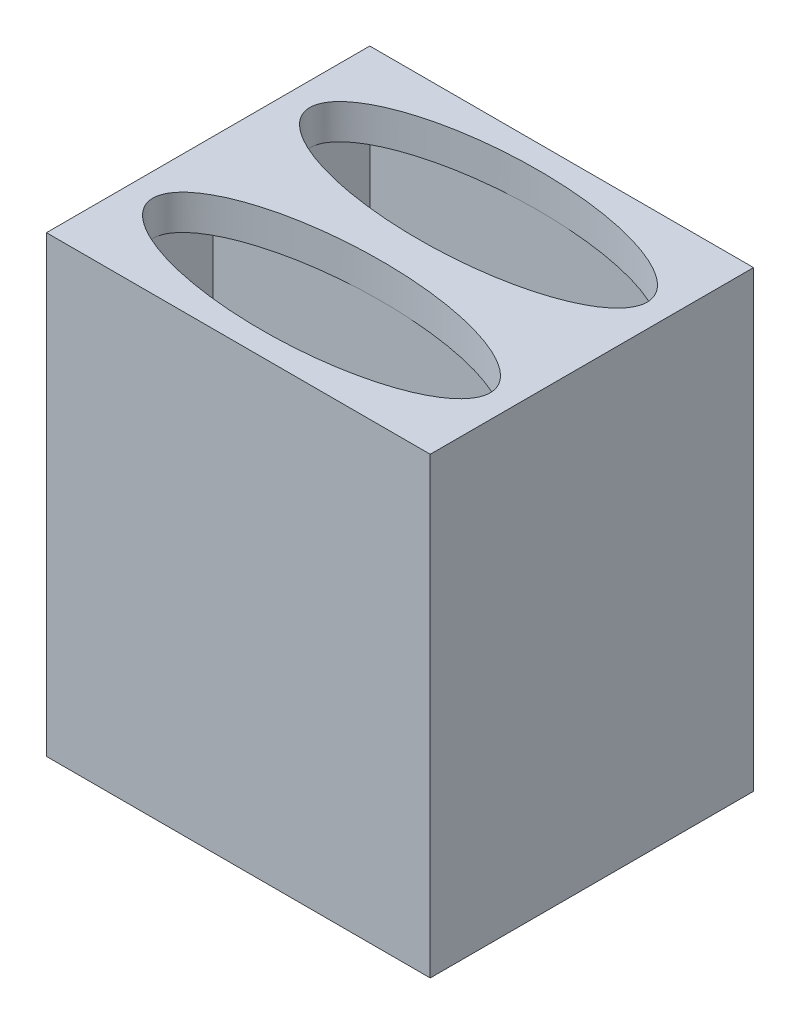
ISO-10303-21;
HEADER;
FILE_DESCRIPTION(('STEP AP214'),'2;1');
FILE_NAME('part.step','',(''),(''),'','','');
FILE_SCHEMA(('AUTOMOTIVE_DESIGN { 1 0 10303 214 1 1 1 1 }'));
ENDSEC;
DATA;
#1=APPLICATION_CONTEXT('core data for automotive mechanical design processes');
#2=APPLICATION_PROTOCOL_DEFINITION('international standard','automotive_design',2000,#1);
#3=PRODUCT_CONTEXT('',#1,'mechanical');
#4=PRODUCT('Part','Part','',(#3));
#5=PRODUCT_RELATED_PRODUCT_CATEGORY('part','',(#4));
#6=PRODUCT_DEFINITION_FORMATION('','',#4);
#7=PRODUCT_DEFINITION_CONTEXT('part definition',#1,'design');
#8=PRODUCT_DEFINITION('design','',#6,#7);
#9=PRODUCT_DEFINITION_SHAPE('','',#8);
#10=(LENGTH_UNIT() NAMED_UNIT(*) SI_UNIT(.MILLI.,.METRE.));
#11=(NAMED_UNIT(*) PLANE_ANGLE_UNIT() SI_UNIT($,.RADIAN.));
#12=(NAMED_UNIT(*) SI_UNIT($,.STERADIAN.) SOLID_ANGLE_UNIT());
#13=UNCERTAINTY_MEASURE_WITH_UNIT(LENGTH_MEASURE(1.E-05),#10,'distance_accuracy_value','');
#14=(GEOMETRIC_REPRESENTATION_CONTEXT(3) GLOBAL_UNCERTAINTY_ASSIGNED_CONTEXT((#13)) GLOBAL_UNIT_ASSIGNED_CONTEXT((#10,
#11,#12)) REPRESENTATION_CONTEXT('',''));
#15=CARTESIAN_POINT('',(0.,0.,0.));
#16=DIRECTION('',(0.,0.,1.));
#17=DIRECTION('',(1.,0.,0.));
#18=AXIS2_PLACEMENT_3D('',#15,#16,#17);
#19=CARTESIAN_POINT('',(0.,0.,0.));
#20=DIRECTION('',(0.,1.,0.));
#21=DIRECTION('',(0.,0.,1.));
#22=AXIS2_PLACEMENT_3D('',#19,#20,#21);
#23=PLANE('',#22);
#24=DIRECTION('',(1.,0.,0.));
#25=VECTOR('',#24,1.);
#26=CARTESIAN_POINT('',(-16.5,0.,20.65));
#27=LINE('',#26,#25);
#28=CARTESIAN_POINT('',(-16.5,0.,20.65));
#29=VERTEX_POINT('',#28);
#30=CARTESIAN_POINT('',(16.5,0.,20.65));
#31=VERTEX_POINT('',#30);
#32=EDGE_CURVE('E169',#29,#31,#27,.T.);
#33=ORIENTED_EDGE('',*,*,#32,.F.);
#34=DIRECTION('',(0.,0.,1.));
#35=VECTOR('',#34,1.);
#36=CARTESIAN_POINT('',(-16.5,0.,7.15));
#37=LINE('',#36,#35);
#38=CARTESIAN_POINT('',(-16.5,0.,-7.15));
#39=VERTEX_POINT('',#38);
#40=EDGE_CURVE('E164',#39,#29,#37,.T.);
#41=ORIENTED_EDGE('',*,*,#40,.F.);
#42=DIRECTION('',(-1.,0.,0.));
#43=VECTOR('',#42,1.);
#44=CARTESIAN_POINT('',(-16.5,0.,-7.15));
#45=LINE('',#44,#43);
#46=CARTESIAN_POINT('',(16.5,0.,-7.15));
#47=VERTEX_POINT('',#46);
#48=EDGE_CURVE('E275',#47,#39,#45,.T.);
#49=ORIENTED_EDGE('',*,*,#48,.F.);
#50=DIRECTION('',(0.,0.,-1.));
#51=VECTOR('',#50,1.);
#52=CARTESIAN_POINT('',(16.5,0.,7.15));
#53=LINE('',#52,#51);
#54=EDGE_CURVE('E277',#31,#47,#53,.T.);
#55=ORIENTED_EDGE('',*,*,#54,.F.);
#56=EDGE_LOOP('',(#33,#41,#49,#55));
#57=FACE_BOUND('',#56,.T.);
#58=DIRECTION('',(0.,0.,-1.));
#59=VECTOR('',#58,1.);
#60=CARTESIAN_POINT('',(14.5,0.,18.65));
#61=LINE('',#60,#59);
#62=CARTESIAN_POINT('',(14.5,0.,18.65));
#63=VERTEX_POINT('',#62);
#64=CARTESIAN_POINT('',(14.5,0.,8.35));
#65=VERTEX_POINT('',#64);
#66=EDGE_CURVE('E187',#63,#65,#61,.T.);
#67=ORIENTED_EDGE('',*,*,#66,.T.);
#68=DIRECTION('',(-1.,0.,0.));
#69=VECTOR('',#68,1.);
#70=CARTESIAN_POINT('',(-14.5,0.,8.35));
#71=LINE('',#70,#69);
#72=CARTESIAN_POINT('',(-14.5,0.,8.35));
#73=VERTEX_POINT('',#72);
#74=EDGE_CURVE('E205',#65,#73,#71,.T.);
#75=ORIENTED_EDGE('',*,*,#74,.T.);
#76=DIRECTION('',(0.,0.,1.));
#77=VECTOR('',#76,1.);
#78=CARTESIAN_POINT('',(-14.5,0.,18.65));
#79=LINE('',#78,#77);
#80=CARTESIAN_POINT('',(-14.5,0.,18.65));
#81=VERTEX_POINT('',#80);
#82=EDGE_CURVE('E208',#73,#81,#79,.T.);
#83=ORIENTED_EDGE('',*,*,#82,.T.);
#84=DIRECTION('',(1.,0.,0.));
#85=VECTOR('',#84,1.);
#86=CARTESIAN_POINT('',(-14.5,0.,18.65));
#87=LINE('',#86,#85);
#88=EDGE_CURVE('E192',#81,#63,#87,.T.);
#89=ORIENTED_EDGE('',*,*,#88,.T.);
#90=EDGE_LOOP('',(#67,#75,#83,#89));
#91=FACE_BOUND('',#90,.T.);
#92=DIRECTION('',(0.,0.,-1.));
#93=VECTOR('',#92,1.);
#94=CARTESIAN_POINT('',(14.5,0.,5.15));
#95=LINE('',#94,#93);
#96=CARTESIAN_POINT('',(14.5,0.,5.15));
#97=VERTEX_POINT('',#96);
#98=CARTESIAN_POINT('',(14.5,0.,-5.15));
#99=VERTEX_POINT('',#98);
#100=EDGE_CURVE('E158',#97,#99,#95,.T.);
#101=ORIENTED_EDGE('',*,*,#100,.T.);
#102=DIRECTION('',(-1.,0.,0.));
#103=VECTOR('',#102,1.);
#104=CARTESIAN_POINT('',(-14.5,0.,-5.15));
#105=LINE('',#104,#103);
#106=CARTESIAN_POINT('',(-14.5,0.,-5.15));
#107=VERTEX_POINT('',#106);
#108=EDGE_CURVE('E300',#99,#107,#105,.T.);
#109=ORIENTED_EDGE('',*,*,#108,.T.);
#110=DIRECTION('',(0.,0.,1.));
#111=VECTOR('',#110,1.);
#112=CARTESIAN_POINT('',(-14.5,0.,5.15));
#113=LINE('',#112,#111);
#114=CARTESIAN_POINT('',(-14.5,0.,5.15));
#115=VERTEX_POINT('',#114);
#116=EDGE_CURVE('E297',#107,#115,#113,.T.);
#117=ORIENTED_EDGE('',*,*,#116,.T.);
#118=DIRECTION('',(1.,0.,0.));
#119=VECTOR('',#118,1.);
#120=CARTESIAN_POINT('',(-14.5,0.,5.15));
#121=LINE('',#120,#119);
#122=EDGE_CURVE('E293',#115,#97,#121,.T.);
#123=ORIENTED_EDGE('',*,*,#122,.T.);
#124=EDGE_LOOP('',(#101,#109,#117,#123));
#125=FACE_BOUND('',#124,.T.);
#126=ADVANCED_FACE('F33',(#57,#91,#125),#23,.F.);
#127=CARTESIAN_POINT('',(16.5,36.,7.15));
#128=DIRECTION('',(-1.,0.,0.));
#129=DIRECTION('',(0.,0.,1.));
#130=AXIS2_PLACEMENT_3D('',#127,#128,#129);
#131=PLANE('',#130);
#132=DIRECTION('',(0.,0.,-1.));
#133=VECTOR('',#132,1.);
#134=CARTESIAN_POINT('',(16.5,39.,-7.15));
#135=LINE('',#134,#133);
#136=CARTESIAN_POINT('',(16.5,39.,20.65));
#137=VERTEX_POINT('',#136);
#138=CARTESIAN_POINT('',(16.5,39.,-7.15));
#139=VERTEX_POINT('',#138);
#140=EDGE_CURVE('E229',#137,#139,#135,.T.);
#141=ORIENTED_EDGE('',*,*,#140,.F.);
#142=DIRECTION('',(0.,-1.,0.));
#143=VECTOR('',#142,1.);
#144=CARTESIAN_POINT('',(16.5,36.,20.65));
#145=LINE('',#144,#143);
#146=EDGE_CURVE('E168',#137,#31,#145,.T.);
#147=ORIENTED_EDGE('',*,*,#146,.T.);
#148=ORIENTED_EDGE('',*,*,#54,.T.);
#149=DIRECTION('',(0.,-1.,0.));
#150=VECTOR('',#149,1.);
#151=CARTESIAN_POINT('',(16.5,36.,-7.15));
#152=LINE('',#151,#150);
#153=EDGE_CURVE('E11',#139,#47,#152,.T.);
#154=ORIENTED_EDGE('',*,*,#153,.F.);
#155=EDGE_LOOP('',(#141,#147,#148,#154));
#156=FACE_BOUND('',#155,.T.);
#157=ADVANCED_FACE('F35',(#156),#131,.F.);
#158=CARTESIAN_POINT('',(-16.5,36.,-7.15));
#159=DIRECTION('',(0.,0.,1.));
#160=DIRECTION('',(1.,0.,0.));
#161=AXIS2_PLACEMENT_3D('',#158,#159,#160);
#162=PLANE('',#161);
#163=ORIENTED_EDGE('',*,*,#48,.T.);
#164=DIRECTION('',(0.,-1.,0.));
#165=VECTOR('',#164,1.);
#166=CARTESIAN_POINT('',(-16.5,36.,-7.15));
#167=LINE('',#166,#165);
#168=CARTESIAN_POINT('',(-16.5,39.,-7.15));
#169=VERTEX_POINT('',#168);
#170=EDGE_CURVE('E41',#169,#39,#167,.T.);
#171=ORIENTED_EDGE('',*,*,#170,.F.);
#172=DIRECTION('',(-1.,0.,0.));
#173=VECTOR('',#172,1.);
#174=CARTESIAN_POINT('',(16.5,39.,-7.15));
#175=LINE('',#174,#173);
#176=EDGE_CURVE('E155',#139,#169,#175,.T.);
#177=ORIENTED_EDGE('',*,*,#176,.F.);
#178=ORIENTED_EDGE('',*,*,#153,.T.);
#179=EDGE_LOOP('',(#163,#171,#177,#178));
#180=FACE_BOUND('',#179,.T.);
#181=ADVANCED_FACE('F267',(#180),#162,.F.);
#182=CARTESIAN_POINT('',(-16.5,36.,7.15));
#183=DIRECTION('',(1.,0.,0.));
#184=DIRECTION('',(0.,0.,-1.));
#185=AXIS2_PLACEMENT_3D('',#182,#183,#184);
#186=PLANE('',#185);
#187=DIRECTION('',(0.,-1.,0.));
#188=VECTOR('',#187,1.);
#189=CARTESIAN_POINT('',(-16.5,36.,20.65));
#190=LINE('',#189,#188);
#191=CARTESIAN_POINT('',(-16.5,39.,20.65));
#192=VERTEX_POINT('',#191);
#193=EDGE_CURVE('E161',#192,#29,#190,.T.);
#194=ORIENTED_EDGE('',*,*,#193,.F.);
#195=DIRECTION('',(0.,0.,1.));
#196=VECTOR('',#195,1.);
#197=CARTESIAN_POINT('',(-16.5,39.,-7.15));
#198=LINE('',#197,#196);
#199=EDGE_CURVE('E148',#169,#192,#198,.T.);
#200=ORIENTED_EDGE('',*,*,#199,.F.);
#201=ORIENTED_EDGE('',*,*,#170,.T.);
#202=ORIENTED_EDGE('',*,*,#40,.T.);
#203=EDGE_LOOP('',(#194,#200,#201,#202));
#204=FACE_BOUND('',#203,.T.);
#205=ADVANCED_FACE('F162',(#204),#186,.F.);
#206=CARTESIAN_POINT('',(14.5,36.,5.15));
#207=DIRECTION('',(-1.,0.,0.));
#208=DIRECTION('',(0.,0.,1.));
#209=AXIS2_PLACEMENT_3D('',#206,#207,#208);
#210=PLANE('',#209);
#211=ORIENTED_EDGE('',*,*,#100,.F.);
#212=DIRECTION('',(0.,-1.,0.));
#213=VECTOR('',#212,1.);
#214=CARTESIAN_POINT('',(14.5,36.,5.15));
#215=LINE('',#214,#213);
#216=CARTESIAN_POINT('',(14.5,36.,5.15));
#217=VERTEX_POINT('',#216);
#218=EDGE_CURVE('E290',#217,#97,#215,.T.);
#219=ORIENTED_EDGE('',*,*,#218,.F.);
#220=DIRECTION('',(0.,0.,-1.));
#221=VECTOR('',#220,1.);
#222=CARTESIAN_POINT('',(14.5,36.,5.15));
#223=LINE('',#222,#221);
#224=CARTESIAN_POINT('',(14.5,36.,0.));
#225=VERTEX_POINT('',#224);
#226=EDGE_CURVE('E315',#217,#225,#223,.T.);
#227=ORIENTED_EDGE('',*,*,#226,.T.);
#228=CARTESIAN_POINT('',(14.5,36.,-5.15));
#229=VERTEX_POINT('',#228);
#230=EDGE_CURVE('E296',#225,#229,#223,.T.);
#231=ORIENTED_EDGE('',*,*,#230,.T.);
#232=DIRECTION('',(0.,-1.,0.));
#233=VECTOR('',#232,1.);
#234=CARTESIAN_POINT('',(14.5,36.,-5.15));
#235=LINE('',#234,#233);
#236=EDGE_CURVE('E283',#229,#99,#235,.T.);
#237=ORIENTED_EDGE('',*,*,#236,.T.);
#238=EDGE_LOOP('',(#211,#219,#227,#231,#237));
#239=FACE_BOUND('',#238,.T.);
#240=ADVANCED_FACE('F258',(#239),#210,.T.);
#241=CARTESIAN_POINT('',(-14.5,36.,-5.15));
#242=DIRECTION('',(0.,0.,1.));
#243=DIRECTION('',(1.,0.,0.));
#244=AXIS2_PLACEMENT_3D('',#241,#242,#243);
#245=PLANE('',#244);
#246=ORIENTED_EDGE('',*,*,#108,.F.);
#247=ORIENTED_EDGE('',*,*,#236,.F.);
#248=DIRECTION('',(-1.,0.,0.));
#249=VECTOR('',#248,1.);
#250=CARTESIAN_POINT('',(-14.5,36.,-5.15));
#251=LINE('',#250,#249);
#252=CARTESIAN_POINT('',(0.,36.,-5.15));
#253=VERTEX_POINT('',#252);
#254=EDGE_CURVE('E311',#229,#253,#251,.T.);
#255=ORIENTED_EDGE('',*,*,#254,.T.);
#256=CARTESIAN_POINT('',(-14.5,36.,-5.15));
#257=VERTEX_POINT('',#256);
#258=EDGE_CURVE('E314',#253,#257,#251,.T.);
#259=ORIENTED_EDGE('',*,*,#258,.T.);
#260=DIRECTION('',(0.,-1.,0.));
#261=VECTOR('',#260,1.);
#262=CARTESIAN_POINT('',(-14.5,36.,-5.15));
#263=LINE('',#262,#261);
#264=EDGE_CURVE('E286',#257,#107,#263,.T.);
#265=ORIENTED_EDGE('',*,*,#264,.T.);
#266=EDGE_LOOP('',(#246,#247,#255,#259,#265));
#267=FACE_BOUND('',#266,.T.);
#268=ADVANCED_FACE('F254',(#267),#245,.T.);
#269=CARTESIAN_POINT('',(-14.5,36.,5.15));
#270=DIRECTION('',(1.,0.,0.));
#271=DIRECTION('',(0.,0.,-1.));
#272=AXIS2_PLACEMENT_3D('',#269,#270,#271);
#273=PLANE('',#272);
#274=ORIENTED_EDGE('',*,*,#116,.F.);
#275=ORIENTED_EDGE('',*,*,#264,.F.);
#276=DIRECTION('',(0.,0.,1.));
#277=VECTOR('',#276,1.);
#278=CARTESIAN_POINT('',(-14.5,36.,5.15));
#279=LINE('',#278,#277);
#280=CARTESIAN_POINT('',(-14.5,36.,0.));
#281=VERTEX_POINT('',#280);
#282=EDGE_CURVE('E307',#257,#281,#279,.T.);
#283=ORIENTED_EDGE('',*,*,#282,.T.);
#284=CARTESIAN_POINT('',(-14.5,36.,5.15));
#285=VERTEX_POINT('',#284);
#286=EDGE_CURVE('E310',#281,#285,#279,.T.);
#287=ORIENTED_EDGE('',*,*,#286,.T.);
#288=DIRECTION('',(0.,-1.,0.));
#289=VECTOR('',#288,1.);
#290=CARTESIAN_POINT('',(-14.5,36.,5.15));
#291=LINE('',#290,#289);
#292=EDGE_CURVE('E288',#285,#115,#291,.T.);
#293=ORIENTED_EDGE('',*,*,#292,.T.);
#294=EDGE_LOOP('',(#274,#275,#283,#287,#293));
#295=FACE_BOUND('',#294,.T.);
#296=ADVANCED_FACE('F250',(#295),#273,.T.);
#297=CARTESIAN_POINT('',(-14.5,36.,5.15));
#298=DIRECTION('',(0.,0.,-1.));
#299=DIRECTION('',(-1.,0.,0.));
#300=AXIS2_PLACEMENT_3D('',#297,#298,#299);
#301=PLANE('',#300);
#302=ORIENTED_EDGE('',*,*,#122,.F.);
#303=ORIENTED_EDGE('',*,*,#292,.F.);
#304=DIRECTION('',(1.,0.,0.));
#305=VECTOR('',#304,1.);
#306=CARTESIAN_POINT('',(-14.5,36.,5.15));
#307=LINE('',#306,#305);
#308=CARTESIAN_POINT('',(0.,36.,5.15));
#309=VERTEX_POINT('',#308);
#310=EDGE_CURVE('E56',#285,#309,#307,.T.);
#311=ORIENTED_EDGE('',*,*,#310,.T.);
#312=EDGE_CURVE('E306',#309,#217,#307,.T.);
#313=ORIENTED_EDGE('',*,*,#312,.T.);
#314=ORIENTED_EDGE('',*,*,#218,.T.);
#315=EDGE_LOOP('',(#302,#303,#311,#313,#314));
#316=FACE_BOUND('',#315,.T.);
#317=ADVANCED_FACE('F246',(#316),#301,.T.);
#318=CARTESIAN_POINT('',(0.,36.,0.));
#319=DIRECTION('',(0.,-1.,0.));
#320=DIRECTION('',(0.,0.,-1.));
#321=AXIS2_PLACEMENT_3D('',#318,#319,#320);
#322=PLANE('',#321);
#323=ORIENTED_EDGE('',*,*,#226,.F.);
#324=ORIENTED_EDGE('',*,*,#312,.F.);
#325=CARTESIAN_POINT('',(0.,36.,0.));
#326=DIRECTION('',(0.,1.,0.));
#327=DIRECTION('',(1.,0.,0.));
#328=AXIS2_PLACEMENT_3D('',#325,#326,#327);
#329=ELLIPSE('',#328,14.5,5.15);
#330=EDGE_CURVE('E224',#309,#225,#329,.T.);
#331=ORIENTED_EDGE('',*,*,#330,.T.);
#332=EDGE_LOOP('',(#323,#324,#331));
#333=FACE_BOUND('',#332,.T.);
#334=ADVANCED_FACE('F242',(#333),#322,.T.);
#335=ORIENTED_EDGE('',*,*,#230,.F.);
#336=EDGE_CURVE('E230',#225,#253,#329,.T.);
#337=ORIENTED_EDGE('',*,*,#336,.T.);
#338=ORIENTED_EDGE('',*,*,#254,.F.);
#339=EDGE_LOOP('',(#335,#337,#338));
#340=FACE_BOUND('',#339,.T.);
#341=ADVANCED_FACE('F245',(#340),#322,.T.);
#342=ORIENTED_EDGE('',*,*,#258,.F.);
#343=EDGE_CURVE('E338',#253,#281,#329,.T.);
#344=ORIENTED_EDGE('',*,*,#343,.T.);
#345=ORIENTED_EDGE('',*,*,#282,.F.);
#346=EDGE_LOOP('',(#342,#344,#345));
#347=FACE_BOUND('',#346,.T.);
#348=ADVANCED_FACE('F341',(#347),#322,.T.);
#349=ORIENTED_EDGE('',*,*,#310,.F.);
#350=ORIENTED_EDGE('',*,*,#286,.F.);
#351=EDGE_CURVE('E336',#281,#309,#329,.T.);
#352=ORIENTED_EDGE('',*,*,#351,.T.);
#353=EDGE_LOOP('',(#349,#350,#352));
#354=FACE_BOUND('',#353,.T.);
#355=ADVANCED_FACE('F241',(#354),#322,.T.);
#356=CARTESIAN_POINT('',(0.,39.,0.));
#357=DIRECTION('',(0.,-1.,0.));
#358=DIRECTION('',(0.,0.,-1.));
#359=AXIS2_PLACEMENT_3D('',#356,#357,#358);
#360=PLANE('',#359);
#361=ORIENTED_EDGE('',*,*,#140,.T.);
#362=ORIENTED_EDGE('',*,*,#176,.T.);
#363=ORIENTED_EDGE('',*,*,#199,.T.);
#364=DIRECTION('',(1.,0.,0.));
#365=VECTOR('',#364,1.);
#366=CARTESIAN_POINT('',(16.5,39.,20.65));
#367=LINE('',#366,#365);
#368=EDGE_CURVE('E153',#192,#137,#367,.T.);
#369=ORIENTED_EDGE('',*,*,#368,.T.);
#370=EDGE_LOOP('',(#361,#362,#363,#369));
#371=FACE_BOUND('',#370,.T.);
#372=CARTESIAN_POINT('',(0.,39.,0.));
#373=DIRECTION('',(0.,1.,0.));
#374=DIRECTION('',(1.,0.,0.));
#375=AXIS2_PLACEMENT_3D('',#372,#373,#374);
#376=ELLIPSE('',#375,14.5,5.15);
#377=CARTESIAN_POINT('',(14.5,39.,0.));
#378=VERTEX_POINT('',#377);
#379=EDGE_CURVE('E225',#378,#378,#376,.T.);
#380=ORIENTED_EDGE('',*,*,#379,.F.);
#381=EDGE_LOOP('',(#380));
#382=FACE_BOUND('',#381,.T.);
#383=CARTESIAN_POINT('',(0.,39.,13.5));
#384=DIRECTION('',(0.,1.,0.));
#385=DIRECTION('',(1.,0.,0.));
#386=AXIS2_PLACEMENT_3D('',#383,#384,#385);
#387=ELLIPSE('',#386,14.5,5.15);
#388=CARTESIAN_POINT('',(14.5,39.,13.5));
#389=VERTEX_POINT('',#388);
#390=EDGE_CURVE('E175',#389,#389,#387,.T.);
#391=ORIENTED_EDGE('',*,*,#390,.F.);
#392=EDGE_LOOP('',(#391));
#393=FACE_BOUND('',#392,.T.);
#394=ADVANCED_FACE('F150',(#371,#382,#393),#360,.F.);
#395=DIRECTION('',(0.,-1.,0.));
#396=VECTOR('',#395,1.);
#397=SURFACE_OF_LINEAR_EXTRUSION('',#376,#396);
#398=ORIENTED_EDGE('',*,*,#379,.T.);
#399=EDGE_LOOP('',(#398));
#400=FACE_BOUND('',#399,.T.);
#401=ORIENTED_EDGE('',*,*,#336,.F.);
#402=ORIENTED_EDGE('',*,*,#330,.F.);
#403=ORIENTED_EDGE('',*,*,#351,.F.);
#404=ORIENTED_EDGE('',*,*,#343,.F.);
#405=EDGE_LOOP('',(#401,#402,#403,#404));
#406=FACE_BOUND('',#405,.T.);
#407=ADVANCED_FACE('F233',(#400,#406),#397,.T.);
#408=CARTESIAN_POINT('',(-16.5,36.,20.65));
#409=DIRECTION('',(0.,0.,-1.));
#410=DIRECTION('',(-1.,0.,0.));
#411=AXIS2_PLACEMENT_3D('',#408,#409,#410);
#412=PLANE('',#411);
#413=ORIENTED_EDGE('',*,*,#32,.T.);
#414=ORIENTED_EDGE('',*,*,#146,.F.);
#415=ORIENTED_EDGE('',*,*,#368,.F.);
#416=ORIENTED_EDGE('',*,*,#193,.T.);
#417=EDGE_LOOP('',(#413,#414,#415,#416));
#418=FACE_BOUND('',#417,.T.);
#419=ADVANCED_FACE('F172',(#418),#412,.F.);
#420=CARTESIAN_POINT('',(14.5,36.,18.65));
#421=DIRECTION('',(-1.,0.,0.));
#422=DIRECTION('',(0.,0.,1.));
#423=AXIS2_PLACEMENT_3D('',#420,#421,#422);
#424=PLANE('',#423);
#425=ORIENTED_EDGE('',*,*,#66,.F.);
#426=DIRECTION('',(0.,-1.,0.));
#427=VECTOR('',#426,1.);
#428=CARTESIAN_POINT('',(14.5,36.,18.65));
#429=LINE('',#428,#427);
#430=CARTESIAN_POINT('',(14.5,36.,18.65));
#431=VERTEX_POINT('',#430);
#432=EDGE_CURVE('E202',#431,#63,#429,.T.);
#433=ORIENTED_EDGE('',*,*,#432,.F.);
#434=DIRECTION('',(0.,0.,-1.));
#435=VECTOR('',#434,1.);
#436=CARTESIAN_POINT('',(14.5,36.,18.65));
#437=LINE('',#436,#435);
#438=CARTESIAN_POINT('',(14.5,36.,13.5));
#439=VERTEX_POINT('',#438);
#440=EDGE_CURVE('E188',#431,#439,#437,.T.);
#441=ORIENTED_EDGE('',*,*,#440,.T.);
#442=DIRECTION('',(0.,0.,1.));
#443=VECTOR('',#442,1.);
#444=CARTESIAN_POINT('',(14.5,36.,18.65));
#445=LINE('',#444,#443);
#446=CARTESIAN_POINT('',(14.5,36.,8.35));
#447=VERTEX_POINT('',#446);
#448=EDGE_CURVE('E177',#447,#439,#445,.T.);
#449=ORIENTED_EDGE('',*,*,#448,.F.);
#450=DIRECTION('',(0.,-1.,0.));
#451=VECTOR('',#450,1.);
#452=CARTESIAN_POINT('',(14.5,36.,8.35));
#453=LINE('',#452,#451);
#454=EDGE_CURVE('E219',#447,#65,#453,.T.);
#455=ORIENTED_EDGE('',*,*,#454,.T.);
#456=EDGE_LOOP('',(#425,#433,#441,#449,#455));
#457=FACE_BOUND('',#456,.T.);
#458=ADVANCED_FACE('F366',(#457),#424,.T.);
#459=CARTESIAN_POINT('',(-14.5,36.,8.35));
#460=DIRECTION('',(0.,0.,1.));
#461=DIRECTION('',(1.,0.,0.));
#462=AXIS2_PLACEMENT_3D('',#459,#460,#461);
#463=PLANE('',#462);
#464=ORIENTED_EDGE('',*,*,#74,.F.);
#465=ORIENTED_EDGE('',*,*,#454,.F.);
#466=DIRECTION('',(-1.,0.,0.));
#467=VECTOR('',#466,1.);
#468=CARTESIAN_POINT('',(-14.5,36.,8.35));
#469=LINE('',#468,#467);
#470=CARTESIAN_POINT('',(0.,36.,8.35));
#471=VERTEX_POINT('',#470);
#472=EDGE_CURVE('E191',#447,#471,#469,.T.);
#473=ORIENTED_EDGE('',*,*,#472,.T.);
#474=DIRECTION('',(1.,0.,0.));
#475=VECTOR('',#474,1.);
#476=CARTESIAN_POINT('',(-14.5,36.,8.35));
#477=LINE('',#476,#475);
#478=CARTESIAN_POINT('',(-14.5,36.,8.35));
#479=VERTEX_POINT('',#478);
#480=EDGE_CURVE('E185',#479,#471,#477,.T.);
#481=ORIENTED_EDGE('',*,*,#480,.F.);
#482=DIRECTION('',(0.,-1.,0.));
#483=VECTOR('',#482,1.);
#484=CARTESIAN_POINT('',(-14.5,36.,8.35));
#485=LINE('',#484,#483);
#486=EDGE_CURVE('E217',#479,#73,#485,.T.);
#487=ORIENTED_EDGE('',*,*,#486,.T.);
#488=EDGE_LOOP('',(#464,#465,#473,#481,#487));
#489=FACE_BOUND('',#488,.T.);
#490=ADVANCED_FACE('F372',(#489),#463,.T.);
#491=CARTESIAN_POINT('',(-14.5,36.,18.65));
#492=DIRECTION('',(1.,0.,0.));
#493=DIRECTION('',(0.,0.,-1.));
#494=AXIS2_PLACEMENT_3D('',#491,#492,#493);
#495=PLANE('',#494);
#496=ORIENTED_EDGE('',*,*,#82,.F.);
#497=ORIENTED_EDGE('',*,*,#486,.F.);
#498=DIRECTION('',(0.,0.,1.));
#499=VECTOR('',#498,1.);
#500=CARTESIAN_POINT('',(-14.5,36.,18.65));
#501=LINE('',#500,#499);
#502=CARTESIAN_POINT('',(-14.5,36.,13.5));
#503=VERTEX_POINT('',#502);
#504=EDGE_CURVE('E195',#479,#503,#501,.T.);
#505=ORIENTED_EDGE('',*,*,#504,.T.);
#506=DIRECTION('',(0.,0.,-1.));
#507=VECTOR('',#506,1.);
#508=CARTESIAN_POINT('',(-14.5,36.,18.65));
#509=LINE('',#508,#507);
#510=CARTESIAN_POINT('',(-14.5,36.,18.65));
#511=VERTEX_POINT('',#510);
#512=EDGE_CURVE('E174',#511,#503,#509,.T.);
#513=ORIENTED_EDGE('',*,*,#512,.F.);
#514=DIRECTION('',(0.,-1.,0.));
#515=VECTOR('',#514,1.);
#516=CARTESIAN_POINT('',(-14.5,36.,18.65));
#517=LINE('',#516,#515);
#518=EDGE_CURVE('E215',#511,#81,#517,.T.);
#519=ORIENTED_EDGE('',*,*,#518,.T.);
#520=EDGE_LOOP('',(#496,#497,#505,#513,#519));
#521=FACE_BOUND('',#520,.T.);
#522=ADVANCED_FACE('F379',(#521),#495,.T.);
#523=CARTESIAN_POINT('',(-14.5,36.,18.65));
#524=DIRECTION('',(0.,0.,-1.));
#525=DIRECTION('',(-1.,0.,0.));
#526=AXIS2_PLACEMENT_3D('',#523,#524,#525);
#527=PLANE('',#526);
#528=ORIENTED_EDGE('',*,*,#88,.F.);
#529=ORIENTED_EDGE('',*,*,#518,.F.);
#530=DIRECTION('',(1.,0.,0.));
#531=VECTOR('',#530,1.);
#532=CARTESIAN_POINT('',(-14.5,36.,18.65));
#533=LINE('',#532,#531);
#534=CARTESIAN_POINT('',(0.,36.,18.65));
#535=VERTEX_POINT('',#534);
#536=EDGE_CURVE('E199',#511,#535,#533,.T.);
#537=ORIENTED_EDGE('',*,*,#536,.T.);
#538=EDGE_CURVE('E198',#535,#431,#533,.T.);
#539=ORIENTED_EDGE('',*,*,#538,.T.);
#540=ORIENTED_EDGE('',*,*,#432,.T.);
#541=EDGE_LOOP('',(#528,#529,#537,#539,#540));
#542=FACE_BOUND('',#541,.T.);
#543=ADVANCED_FACE('F387',(#542),#527,.T.);
#544=CARTESIAN_POINT('',(0.,36.,13.5));
#545=DIRECTION('',(0.,-1.,0.));
#546=DIRECTION('',(0.,0.,-1.));
#547=AXIS2_PLACEMENT_3D('',#544,#545,#546);
#548=PLANE('',#547);
#549=ORIENTED_EDGE('',*,*,#504,.F.);
#550=ORIENTED_EDGE('',*,*,#480,.T.);
#551=CARTESIAN_POINT('',(0.,36.,13.5));
#552=DIRECTION('',(0.,1.,0.));
#553=DIRECTION('',(1.,0.,0.));
#554=AXIS2_PLACEMENT_3D('',#551,#552,#553);
#555=ELLIPSE('',#554,14.5,5.15);
#556=EDGE_CURVE('E558',#471,#503,#555,.T.);
#557=ORIENTED_EDGE('',*,*,#556,.T.);
#558=EDGE_LOOP('',(#549,#550,#557));
#559=FACE_BOUND('',#558,.T.);
#560=ADVANCED_FACE('F395',(#559),#548,.T.);
#561=EDGE_CURVE('E180',#439,#471,#555,.T.);
#562=ORIENTED_EDGE('',*,*,#561,.T.);
#563=ORIENTED_EDGE('',*,*,#472,.F.);
#564=ORIENTED_EDGE('',*,*,#448,.T.);
#565=EDGE_LOOP('',(#562,#563,#564));
#566=FACE_BOUND('',#565,.T.);
#567=ADVANCED_FACE('F403',(#566),#548,.T.);
#568=EDGE_CURVE('E555',#535,#439,#555,.T.);
#569=ORIENTED_EDGE('',*,*,#568,.T.);
#570=ORIENTED_EDGE('',*,*,#440,.F.);
#571=ORIENTED_EDGE('',*,*,#538,.F.);
#572=EDGE_LOOP('',(#569,#570,#571));
#573=FACE_BOUND('',#572,.T.);
#574=ADVANCED_FACE('F412',(#573),#548,.T.);
#575=ORIENTED_EDGE('',*,*,#536,.F.);
#576=ORIENTED_EDGE('',*,*,#512,.T.);
#577=EDGE_CURVE('E48',#503,#535,#555,.T.);
#578=ORIENTED_EDGE('',*,*,#577,.T.);
#579=EDGE_LOOP('',(#575,#576,#578));
#580=FACE_BOUND('',#579,.T.);
#581=ADVANCED_FACE('F406',(#580),#548,.T.);
#582=DIRECTION('',(0.,-1.,0.));
#583=VECTOR('',#582,1.);
#584=SURFACE_OF_LINEAR_EXTRUSION('',#387,#583);
#585=ORIENTED_EDGE('',*,*,#390,.T.);
#586=EDGE_LOOP('',(#585));
#587=FACE_BOUND('',#586,.T.);
#588=ORIENTED_EDGE('',*,*,#561,.F.);
#589=ORIENTED_EDGE('',*,*,#568,.F.);
#590=ORIENTED_EDGE('',*,*,#577,.F.);
#591=ORIENTED_EDGE('',*,*,#556,.F.);
#592=EDGE_LOOP('',(#588,#589,#590,#591));
#593=FACE_BOUND('',#592,.T.);
#594=ADVANCED_FACE('F425',(#587,#593),#584,.T.);
#595=CLOSED_SHELL('',(#126,#157,#181,#205,#240,#268,#296,#317,#334,#341,#348,#355,#394,#407,
#419,#458,#490,#522,#543,#560,#567,#574,#581,#594));
#596=MANIFOLD_SOLID_BREP('B2',#595);
#597=ADVANCED_BREP_SHAPE_REPRESENTATION('',(#18,#596),#14);
#598=SHAPE_DEFINITION_REPRESENTATION(#9,#597);
ENDSEC;
END-ISO-10303-21;
